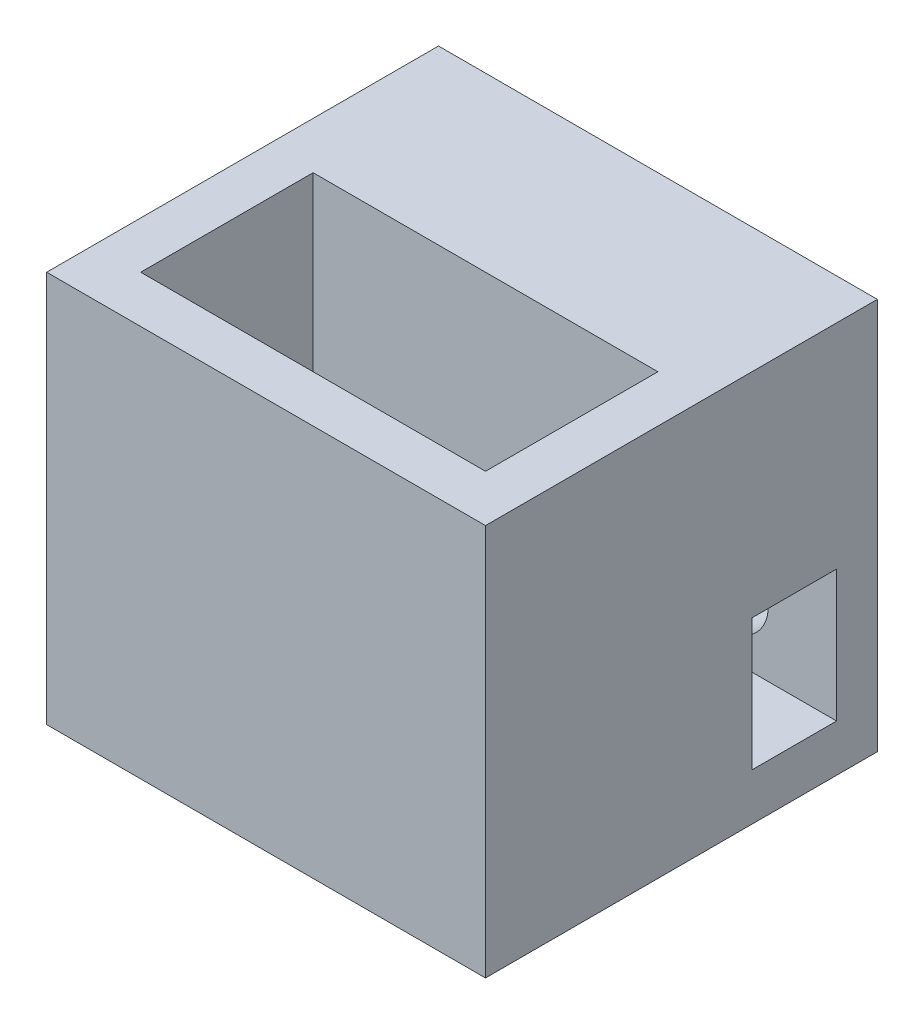
ISO-10303-21;
HEADER;
FILE_DESCRIPTION(('STEP AP214'),'2;1');
FILE_NAME('part.step','',(''),(''),'','','');
FILE_SCHEMA(('AUTOMOTIVE_DESIGN { 1 0 10303 214 1 1 1 1 }'));
ENDSEC;
DATA;
#1=APPLICATION_CONTEXT('core data for automotive mechanical design processes');
#2=APPLICATION_PROTOCOL_DEFINITION('international standard','automotive_design',2000,#1);
#3=PRODUCT_CONTEXT('',#1,'mechanical');
#4=PRODUCT('Part','Part','',(#3));
#5=PRODUCT_RELATED_PRODUCT_CATEGORY('part','',(#4));
#6=PRODUCT_DEFINITION_FORMATION('','',#4);
#7=PRODUCT_DEFINITION_CONTEXT('part definition',#1,'design');
#8=PRODUCT_DEFINITION('design','',#6,#7);
#9=PRODUCT_DEFINITION_SHAPE('','',#8);
#10=(LENGTH_UNIT() NAMED_UNIT(*) SI_UNIT(.MILLI.,.METRE.));
#11=(NAMED_UNIT(*) PLANE_ANGLE_UNIT() SI_UNIT($,.RADIAN.));
#12=(NAMED_UNIT(*) SI_UNIT($,.STERADIAN.) SOLID_ANGLE_UNIT());
#13=UNCERTAINTY_MEASURE_WITH_UNIT(LENGTH_MEASURE(1.E-05),#10,'distance_accuracy_value','');
#14=(GEOMETRIC_REPRESENTATION_CONTEXT(3) GLOBAL_UNCERTAINTY_ASSIGNED_CONTEXT((#13)) GLOBAL_UNIT_ASSIGNED_CONTEXT((#10,
#11,#12)) REPRESENTATION_CONTEXT('',''));
#15=CARTESIAN_POINT('',(0.,0.,0.));
#16=DIRECTION('',(0.,0.,1.));
#17=DIRECTION('',(1.,0.,0.));
#18=AXIS2_PLACEMENT_3D('',#15,#16,#17);
#19=CARTESIAN_POINT('',(-14.,23.,-8.5));
#20=DIRECTION('',(0.,0.,1.));
#21=DIRECTION('',(1.,0.,0.));
#22=AXIS2_PLACEMENT_3D('',#19,#20,#21);
#23=PLANE('',#22);
#24=DIRECTION('',(0.5,0.866025403784439,0.));
#25=VECTOR('',#24,1.);
#26=CARTESIAN_POINT('',(2.15025773880715,5.2,-8.5));
#27=LINE('',#26,#25);
#28=CARTESIAN_POINT('',(2.15025773880715,5.2,-8.5));
#29=VERTEX_POINT('',#28);
#30=CARTESIAN_POINT('',(4.57512886940358,9.4,-8.5));
#31=VERTEX_POINT('',#30);
#32=EDGE_CURVE('E352',#29,#31,#27,.T.);
#33=ORIENTED_EDGE('',*,*,#32,.T.);
#34=DIRECTION('',(1.,0.,0.));
#35=VECTOR('',#34,1.);
#36=CARTESIAN_POINT('',(-14.,9.4,-8.5));
#37=LINE('',#36,#35);
#38=CARTESIAN_POINT('',(14.,9.4,-8.5));
#39=VERTEX_POINT('',#38);
#40=EDGE_CURVE('E344',#31,#39,#37,.T.);
#41=ORIENTED_EDGE('',*,*,#40,.T.);
#42=DIRECTION('',(0.,-1.,0.));
#43=VECTOR('',#42,1.);
#44=CARTESIAN_POINT('',(14.,23.,-8.5));
#45=LINE('',#44,#43);
#46=CARTESIAN_POINT('',(14.,1.,-8.5));
#47=VERTEX_POINT('',#46);
#48=EDGE_CURVE('E293',#39,#47,#45,.T.);
#49=ORIENTED_EDGE('',*,*,#48,.T.);
#50=DIRECTION('',(1.,0.,0.));
#51=VECTOR('',#50,1.);
#52=CARTESIAN_POINT('',(-14.,1.,-8.5));
#53=LINE('',#52,#51);
#54=CARTESIAN_POINT('',(4.57512886940358,1.,-8.5));
#55=VERTEX_POINT('',#54);
#56=EDGE_CURVE('E195',#55,#47,#53,.T.);
#57=ORIENTED_EDGE('',*,*,#56,.F.);
#58=DIRECTION('',(-0.499999999999999,0.866025403784439,0.));
#59=VECTOR('',#58,1.);
#60=CARTESIAN_POINT('',(4.57512886940357,1.,-8.5));
#61=LINE('',#60,#59);
#62=EDGE_CURVE('E61',#55,#29,#61,.T.);
#63=ORIENTED_EDGE('',*,*,#62,.T.);
#64=EDGE_LOOP('',(#33,#41,#49,#57,#63));
#65=FACE_BOUND('',#64,.T.);
#66=ADVANCED_FACE('F45',(#65),#23,.F.);
#67=DIRECTION('',(-0.499999999999999,-0.866025403784439,0.));
#68=VECTOR('',#67,1.);
#69=CARTESIAN_POINT('',(-4.57512886940357,1.,-8.5));
#70=LINE('',#69,#68);
#71=CARTESIAN_POINT('',(-2.15025773880715,5.2,-8.5));
#72=VERTEX_POINT('',#71);
#73=CARTESIAN_POINT('',(-4.57512886940357,1.,-8.5));
#74=VERTEX_POINT('',#73);
#75=EDGE_CURVE('E171',#72,#74,#70,.T.);
#76=ORIENTED_EDGE('',*,*,#75,.T.);
#77=CARTESIAN_POINT('',(-14.,1.,-8.5));
#78=VERTEX_POINT('',#77);
#79=EDGE_CURVE('E183',#78,#74,#53,.T.);
#80=ORIENTED_EDGE('',*,*,#79,.F.);
#81=DIRECTION('',(0.,-1.,0.));
#82=VECTOR('',#81,1.);
#83=CARTESIAN_POINT('',(-14.,23.,-8.5));
#84=LINE('',#83,#82);
#85=CARTESIAN_POINT('',(-14.,9.4,-8.5));
#86=VERTEX_POINT('',#85);
#87=EDGE_CURVE('E290',#86,#78,#84,.T.);
#88=ORIENTED_EDGE('',*,*,#87,.F.);
#89=CARTESIAN_POINT('',(-4.57512886940358,9.4,-8.5));
#90=VERTEX_POINT('',#89);
#91=EDGE_CURVE('E342',#86,#90,#37,.T.);
#92=ORIENTED_EDGE('',*,*,#91,.T.);
#93=DIRECTION('',(0.5,-0.866025403784439,0.));
#94=VECTOR('',#93,1.);
#95=CARTESIAN_POINT('',(-2.15025773880715,5.2,-8.5));
#96=LINE('',#95,#94);
#97=EDGE_CURVE('E186',#90,#72,#96,.T.);
#98=ORIENTED_EDGE('',*,*,#97,.T.);
#99=EDGE_LOOP('',(#76,#80,#88,#92,#98));
#100=FACE_BOUND('',#99,.T.);
#101=ADVANCED_FACE('F182',(#100),#23,.F.);
#102=CARTESIAN_POINT('',(-14.,0.,-13.9));
#103=DIRECTION('',(0.,0.,1.));
#104=DIRECTION('',(0.,-1.,0.));
#105=AXIS2_PLACEMENT_3D('',#102,#103,#104);
#106=PLANE('',#105);
#107=CARTESIAN_POINT('',(7.,5.2,-13.9));
#108=DIRECTION('',(0.,0.,1.));
#109=DIRECTION('',(1.,0.,0.));
#110=AXIS2_PLACEMENT_3D('',#107,#108,#109);
#111=CIRCLE('',#110,2.64999999999999);
#112=CARTESIAN_POINT('',(9.64999999999999,5.2,-13.9));
#113=VERTEX_POINT('',#112);
#114=EDGE_CURVE('E414',#113,#113,#111,.T.);
#115=ORIENTED_EDGE('',*,*,#114,.F.);
#116=EDGE_LOOP('',(#115));
#117=FACE_BOUND('',#116,.T.);
#118=DIRECTION('',(1.,0.,0.));
#119=VECTOR('',#118,1.);
#120=CARTESIAN_POINT('',(-14.,9.4,-13.9));
#121=LINE('',#120,#119);
#122=CARTESIAN_POINT('',(4.57512886940358,9.4,-13.9));
#123=VERTEX_POINT('',#122);
#124=CARTESIAN_POINT('',(14.,9.4,-13.9));
#125=VERTEX_POINT('',#124);
#126=EDGE_CURVE('E341',#123,#125,#121,.T.);
#127=ORIENTED_EDGE('',*,*,#126,.F.);
#128=DIRECTION('',(0.5,0.866025403784438,0.));
#129=VECTOR('',#128,1.);
#130=CARTESIAN_POINT('',(2.15025773880715,5.2,-13.9));
#131=LINE('',#130,#129);
#132=CARTESIAN_POINT('',(2.15025773880715,5.2,-13.9));
#133=VERTEX_POINT('',#132);
#134=EDGE_CURVE('E373',#133,#123,#131,.T.);
#135=ORIENTED_EDGE('',*,*,#134,.F.);
#136=DIRECTION('',(-0.499999999999999,0.866025403784439,0.));
#137=VECTOR('',#136,1.);
#138=CARTESIAN_POINT('',(4.57512886940357,1.,-13.9));
#139=LINE('',#138,#137);
#140=CARTESIAN_POINT('',(4.57512886940357,1.,-13.9));
#141=VERTEX_POINT('',#140);
#142=EDGE_CURVE('E370',#141,#133,#139,.T.);
#143=ORIENTED_EDGE('',*,*,#142,.F.);
#144=DIRECTION('',(1.,0.,0.));
#145=VECTOR('',#144,1.);
#146=CARTESIAN_POINT('',(-14.,1.,-13.9));
#147=LINE('',#146,#145);
#148=CARTESIAN_POINT('',(14.,1.,-13.9));
#149=VERTEX_POINT('',#148);
#150=EDGE_CURVE('E207',#141,#149,#147,.T.);
#151=ORIENTED_EDGE('',*,*,#150,.T.);
#152=DIRECTION('',(0.,-1.,0.));
#153=VECTOR('',#152,1.);
#154=CARTESIAN_POINT('',(14.,0.,-13.9));
#155=LINE('',#154,#153);
#156=EDGE_CURVE('E334',#125,#149,#155,.T.);
#157=ORIENTED_EDGE('',*,*,#156,.F.);
#158=EDGE_LOOP('',(#127,#135,#143,#151,#157));
#159=FACE_BOUND('',#158,.T.);
#160=ADVANCED_FACE('F366',(#117,#159),#106,.T.);
#161=CARTESIAN_POINT('',(-7.,5.2,-13.9));
#162=DIRECTION('',(0.,0.,1.));
#163=DIRECTION('',(1.,0.,0.));
#164=AXIS2_PLACEMENT_3D('',#161,#162,#163);
#165=CIRCLE('',#164,2.64999999999999);
#166=CARTESIAN_POINT('',(-4.35000000000001,5.2,-13.9));
#167=VERTEX_POINT('',#166);
#168=EDGE_CURVE('E422',#167,#167,#165,.T.);
#169=ORIENTED_EDGE('',*,*,#168,.F.);
#170=EDGE_LOOP('',(#169));
#171=FACE_BOUND('',#170,.T.);
#172=CARTESIAN_POINT('',(-14.,1.,-13.9));
#173=VERTEX_POINT('',#172);
#174=CARTESIAN_POINT('',(-4.57512886940358,1.,-13.9));
#175=VERTEX_POINT('',#174);
#176=EDGE_CURVE('E202',#173,#175,#147,.T.);
#177=ORIENTED_EDGE('',*,*,#176,.T.);
#178=DIRECTION('',(-0.499999999999999,-0.866025403784439,0.));
#179=VECTOR('',#178,1.);
#180=CARTESIAN_POINT('',(-4.57512886940357,1.,-13.9));
#181=LINE('',#180,#179);
#182=CARTESIAN_POINT('',(-2.15025773880715,5.2,-13.9));
#183=VERTEX_POINT('',#182);
#184=EDGE_CURVE('E69',#183,#175,#181,.T.);
#185=ORIENTED_EDGE('',*,*,#184,.F.);
#186=DIRECTION('',(0.5,-0.866025403784438,0.));
#187=VECTOR('',#186,1.);
#188=CARTESIAN_POINT('',(-2.15025773880715,5.2,-13.9));
#189=LINE('',#188,#187);
#190=CARTESIAN_POINT('',(-4.57512886940358,9.4,-13.9));
#191=VERTEX_POINT('',#190);
#192=EDGE_CURVE('E405',#191,#183,#189,.T.);
#193=ORIENTED_EDGE('',*,*,#192,.F.);
#194=CARTESIAN_POINT('',(-14.,9.4,-13.9));
#195=VERTEX_POINT('',#194);
#196=EDGE_CURVE('E217',#195,#191,#121,.T.);
#197=ORIENTED_EDGE('',*,*,#196,.F.);
#198=DIRECTION('',(0.,-1.,0.));
#199=VECTOR('',#198,1.);
#200=CARTESIAN_POINT('',(-14.,0.,-13.9));
#201=LINE('',#200,#199);
#202=EDGE_CURVE('E331',#195,#173,#201,.T.);
#203=ORIENTED_EDGE('',*,*,#202,.T.);
#204=EDGE_LOOP('',(#177,#185,#193,#197,#203));
#205=FACE_BOUND('',#204,.T.);
#206=ADVANCED_FACE('F429',(#171,#205),#106,.T.);
#207=CARTESIAN_POINT('',(-14.,9.40000000000001,0.));
#208=DIRECTION('',(0.,-1.,0.));
#209=DIRECTION('',(0.,0.,-1.));
#210=AXIS2_PLACEMENT_3D('',#207,#208,#209);
#211=PLANE('',#210);
#212=ORIENTED_EDGE('',*,*,#40,.F.);
#213=DIRECTION('',(0.,0.,-1.));
#214=VECTOR('',#213,1.);
#215=CARTESIAN_POINT('',(4.57512886940358,9.4,8.502));
#216=LINE('',#215,#214);
#217=EDGE_CURVE('E362',#31,#123,#216,.T.);
#218=ORIENTED_EDGE('',*,*,#217,.T.);
#219=ORIENTED_EDGE('',*,*,#126,.T.);
#220=DIRECTION('',(0.,0.,-1.));
#221=VECTOR('',#220,1.);
#222=CARTESIAN_POINT('',(14.,9.40000000000001,0.));
#223=LINE('',#222,#221);
#224=EDGE_CURVE('E325',#39,#125,#223,.T.);
#225=ORIENTED_EDGE('',*,*,#224,.F.);
#226=EDGE_LOOP('',(#212,#218,#219,#225));
#227=FACE_BOUND('',#226,.T.);
#228=ADVANCED_FACE('F359',(#227),#211,.T.);
#229=ORIENTED_EDGE('',*,*,#196,.T.);
#230=DIRECTION('',(0.,0.,-1.));
#231=VECTOR('',#230,1.);
#232=CARTESIAN_POINT('',(-4.57512886940358,9.4,8.502));
#233=LINE('',#232,#231);
#234=EDGE_CURVE('E398',#90,#191,#233,.T.);
#235=ORIENTED_EDGE('',*,*,#234,.F.);
#236=ORIENTED_EDGE('',*,*,#91,.F.);
#237=DIRECTION('',(0.,0.,-1.));
#238=VECTOR('',#237,1.);
#239=CARTESIAN_POINT('',(-14.,9.40000000000001,0.));
#240=LINE('',#239,#238);
#241=EDGE_CURVE('E320',#86,#195,#240,.T.);
#242=ORIENTED_EDGE('',*,*,#241,.T.);
#243=EDGE_LOOP('',(#229,#235,#236,#242));
#244=FACE_BOUND('',#243,.T.);
#245=ADVANCED_FACE('F440',(#244),#211,.T.);
#246=CARTESIAN_POINT('',(-14.,0.999999999999998,0.));
#247=DIRECTION('',(0.,1.,0.));
#248=DIRECTION('',(0.,0.,1.));
#249=AXIS2_PLACEMENT_3D('',#246,#247,#248);
#250=PLANE('',#249);
#251=ORIENTED_EDGE('',*,*,#150,.F.);
#252=DIRECTION('',(0.,0.,-1.));
#253=VECTOR('',#252,1.);
#254=CARTESIAN_POINT('',(4.57512886940357,1.,8.502));
#255=LINE('',#254,#253);
#256=EDGE_CURVE('E390',#55,#141,#255,.T.);
#257=ORIENTED_EDGE('',*,*,#256,.F.);
#258=ORIENTED_EDGE('',*,*,#56,.T.);
#259=DIRECTION('',(0.,0.,1.));
#260=VECTOR('',#259,1.);
#261=CARTESIAN_POINT('',(14.,0.999999999999998,0.));
#262=LINE('',#261,#260);
#263=EDGE_CURVE('E326',#149,#47,#262,.T.);
#264=ORIENTED_EDGE('',*,*,#263,.F.);
#265=EDGE_LOOP('',(#251,#257,#258,#264));
#266=FACE_BOUND('',#265,.T.);
#267=ADVANCED_FACE('F480',(#266),#250,.T.);
#268=ORIENTED_EDGE('',*,*,#79,.T.);
#269=DIRECTION('',(0.,0.,-1.));
#270=VECTOR('',#269,1.);
#271=CARTESIAN_POINT('',(-4.57512886940357,1.,8.502));
#272=LINE('',#271,#270);
#273=EDGE_CURVE('E168',#74,#175,#272,.T.);
#274=ORIENTED_EDGE('',*,*,#273,.T.);
#275=ORIENTED_EDGE('',*,*,#176,.F.);
#276=DIRECTION('',(0.,0.,1.));
#277=VECTOR('',#276,1.);
#278=CARTESIAN_POINT('',(-14.,0.999999999999998,0.));
#279=LINE('',#278,#277);
#280=EDGE_CURVE('E192',#173,#78,#279,.T.);
#281=ORIENTED_EDGE('',*,*,#280,.T.);
#282=EDGE_LOOP('',(#268,#274,#275,#281));
#283=FACE_BOUND('',#282,.T.);
#284=ADVANCED_FACE('F190',(#283),#250,.T.);
#285=CARTESIAN_POINT('',(0.,23.,0.));
#286=DIRECTION('',(0.,-1.,0.));
#287=DIRECTION('',(0.,0.,-1.));
#288=AXIS2_PLACEMENT_3D('',#285,#286,#287);
#289=PLANE('',#288);
#290=DIRECTION('',(0.,0.,1.));
#291=VECTOR('',#290,1.);
#292=CARTESIAN_POINT('',(-14.,23.,8.5));
#293=LINE('',#292,#291);
#294=CARTESIAN_POINT('',(-14.,23.,-16.5));
#295=VERTEX_POINT('',#294);
#296=CARTESIAN_POINT('',(-14.,23.,8.5));
#297=VERTEX_POINT('',#296);
#298=EDGE_CURVE('E280',#295,#297,#293,.T.);
#299=ORIENTED_EDGE('',*,*,#298,.T.);
#300=DIRECTION('',(1.,0.,0.));
#301=VECTOR('',#300,1.);
#302=CARTESIAN_POINT('',(-14.,23.,8.5));
#303=LINE('',#302,#301);
#304=CARTESIAN_POINT('',(14.,23.,8.5));
#305=VERTEX_POINT('',#304);
#306=EDGE_CURVE('E284',#297,#305,#303,.T.);
#307=ORIENTED_EDGE('',*,*,#306,.T.);
#308=DIRECTION('',(0.,0.,-1.));
#309=VECTOR('',#308,1.);
#310=CARTESIAN_POINT('',(14.,23.,8.5));
#311=LINE('',#310,#309);
#312=CARTESIAN_POINT('',(14.,23.,-16.5));
#313=VERTEX_POINT('',#312);
#314=EDGE_CURVE('E287',#305,#313,#311,.T.);
#315=ORIENTED_EDGE('',*,*,#314,.T.);
#316=DIRECTION('',(1.,0.,0.));
#317=VECTOR('',#316,1.);
#318=CARTESIAN_POINT('',(-14.,23.,-16.5));
#319=LINE('',#318,#317);
#320=EDGE_CURVE('E200',#295,#313,#319,.T.);
#321=ORIENTED_EDGE('',*,*,#320,.F.);
#322=EDGE_LOOP('',(#299,#307,#315,#321));
#323=FACE_BOUND('',#322,.T.);
#324=DIRECTION('',(0.,0.,-1.));
#325=VECTOR('',#324,1.);
#326=CARTESIAN_POINT('',(11.,23.,5.5));
#327=LINE('',#326,#325);
#328=CARTESIAN_POINT('',(11.,23.,5.5));
#329=VERTEX_POINT('',#328);
#330=CARTESIAN_POINT('',(11.,23.,-5.5));
#331=VERTEX_POINT('',#330);
#332=EDGE_CURVE('E237',#329,#331,#327,.T.);
#333=ORIENTED_EDGE('',*,*,#332,.F.);
#334=DIRECTION('',(1.,0.,0.));
#335=VECTOR('',#334,1.);
#336=CARTESIAN_POINT('',(-11.,23.,5.5));
#337=LINE('',#336,#335);
#338=CARTESIAN_POINT('',(-11.,23.,5.5));
#339=VERTEX_POINT('',#338);
#340=EDGE_CURVE('E248',#339,#329,#337,.T.);
#341=ORIENTED_EDGE('',*,*,#340,.F.);
#342=DIRECTION('',(0.,0.,1.));
#343=VECTOR('',#342,1.);
#344=CARTESIAN_POINT('',(-11.,23.,5.5));
#345=LINE('',#344,#343);
#346=CARTESIAN_POINT('',(-11.,23.,-5.5));
#347=VERTEX_POINT('',#346);
#348=EDGE_CURVE('E244',#347,#339,#345,.T.);
#349=ORIENTED_EDGE('',*,*,#348,.F.);
#350=DIRECTION('',(-1.,0.,0.));
#351=VECTOR('',#350,1.);
#352=CARTESIAN_POINT('',(-11.,23.,-5.5));
#353=LINE('',#352,#351);
#354=EDGE_CURVE('E240',#331,#347,#353,.T.);
#355=ORIENTED_EDGE('',*,*,#354,.F.);
#356=EDGE_LOOP('',(#333,#341,#349,#355));
#357=FACE_BOUND('',#356,.T.);
#358=ADVANCED_FACE('F465',(#323,#357),#289,.F.);
#359=CARTESIAN_POINT('',(-14.,23.,8.5));
#360=DIRECTION('',(1.,0.,0.));
#361=DIRECTION('',(0.,0.,-1.));
#362=AXIS2_PLACEMENT_3D('',#359,#360,#361);
#363=PLANE('',#362);
#364=ORIENTED_EDGE('',*,*,#87,.T.);
#365=ORIENTED_EDGE('',*,*,#280,.F.);
#366=ORIENTED_EDGE('',*,*,#202,.F.);
#367=ORIENTED_EDGE('',*,*,#241,.F.);
#368=EDGE_LOOP('',(#364,#365,#366,#367));
#369=FACE_BOUND('',#368,.T.);
#370=ORIENTED_EDGE('',*,*,#298,.F.);
#371=DIRECTION('',(0.,-1.,0.));
#372=VECTOR('',#371,1.);
#373=CARTESIAN_POINT('',(-14.,0.,-16.5));
#374=LINE('',#373,#372);
#375=CARTESIAN_POINT('',(-14.,-2.,-16.5));
#376=VERTEX_POINT('',#375);
#377=EDGE_CURVE('E315',#295,#376,#374,.T.);
#378=ORIENTED_EDGE('',*,*,#377,.T.);
#379=DIRECTION('',(0.,0.,-1.));
#380=VECTOR('',#379,1.);
#381=CARTESIAN_POINT('',(-14.,-2.,8.5));
#382=LINE('',#381,#380);
#383=CARTESIAN_POINT('',(-14.,-2.,8.5));
#384=VERTEX_POINT('',#383);
#385=EDGE_CURVE('E229',#384,#376,#382,.T.);
#386=ORIENTED_EDGE('',*,*,#385,.F.);
#387=DIRECTION('',(0.,-1.,0.));
#388=VECTOR('',#387,1.);
#389=CARTESIAN_POINT('',(-14.,23.,8.5));
#390=LINE('',#389,#388);
#391=EDGE_CURVE('E11',#297,#384,#390,.T.);
#392=ORIENTED_EDGE('',*,*,#391,.F.);
#393=EDGE_LOOP('',(#370,#378,#386,#392));
#394=FACE_BOUND('',#393,.T.);
#395=ADVANCED_FACE('F47',(#369,#394),#363,.F.);
#396=CARTESIAN_POINT('',(0.,23.,8.5));
#397=DIRECTION('',(0.,0.,-1.));
#398=DIRECTION('',(-1.,0.,0.));
#399=AXIS2_PLACEMENT_3D('',#396,#397,#398);
#400=PLANE('',#399);
#401=ORIENTED_EDGE('',*,*,#391,.T.);
#402=DIRECTION('',(-1.,0.,0.));
#403=VECTOR('',#402,1.);
#404=CARTESIAN_POINT('',(14.,-2.,8.5));
#405=LINE('',#404,#403);
#406=CARTESIAN_POINT('',(14.,-2.,8.5));
#407=VERTEX_POINT('',#406);
#408=EDGE_CURVE('E222',#407,#384,#405,.T.);
#409=ORIENTED_EDGE('',*,*,#408,.F.);
#410=DIRECTION('',(0.,-1.,0.));
#411=VECTOR('',#410,1.);
#412=CARTESIAN_POINT('',(14.,23.,8.5));
#413=LINE('',#412,#411);
#414=EDGE_CURVE('E54',#305,#407,#413,.T.);
#415=ORIENTED_EDGE('',*,*,#414,.F.);
#416=ORIENTED_EDGE('',*,*,#306,.F.);
#417=EDGE_LOOP('',(#401,#409,#415,#416));
#418=FACE_BOUND('',#417,.T.);
#419=ADVANCED_FACE('F309',(#418),#400,.F.);
#420=CARTESIAN_POINT('',(14.,23.,8.5));
#421=DIRECTION('',(-1.,0.,0.));
#422=DIRECTION('',(0.,0.,1.));
#423=AXIS2_PLACEMENT_3D('',#420,#421,#422);
#424=PLANE('',#423);
#425=ORIENTED_EDGE('',*,*,#263,.T.);
#426=ORIENTED_EDGE('',*,*,#48,.F.);
#427=ORIENTED_EDGE('',*,*,#224,.T.);
#428=ORIENTED_EDGE('',*,*,#156,.T.);
#429=EDGE_LOOP('',(#425,#426,#427,#428));
#430=FACE_BOUND('',#429,.T.);
#431=ORIENTED_EDGE('',*,*,#414,.T.);
#432=DIRECTION('',(0.,0.,1.));
#433=VECTOR('',#432,1.);
#434=CARTESIAN_POINT('',(14.,-2.,-8.5));
#435=LINE('',#434,#433);
#436=CARTESIAN_POINT('',(14.,-2.,-16.5));
#437=VERTEX_POINT('',#436);
#438=EDGE_CURVE('E232',#437,#407,#435,.T.);
#439=ORIENTED_EDGE('',*,*,#438,.F.);
#440=DIRECTION('',(0.,-1.,0.));
#441=VECTOR('',#440,1.);
#442=CARTESIAN_POINT('',(14.,0.,-16.5));
#443=LINE('',#442,#441);
#444=EDGE_CURVE('E323',#313,#437,#443,.T.);
#445=ORIENTED_EDGE('',*,*,#444,.F.);
#446=ORIENTED_EDGE('',*,*,#314,.F.);
#447=EDGE_LOOP('',(#431,#439,#445,#446));
#448=FACE_BOUND('',#447,.T.);
#449=ADVANCED_FACE('F300',(#430,#448),#424,.F.);
#450=CARTESIAN_POINT('',(11.,23.,5.5));
#451=DIRECTION('',(-1.,0.,0.));
#452=DIRECTION('',(0.,0.,1.));
#453=AXIS2_PLACEMENT_3D('',#450,#451,#452);
#454=PLANE('',#453);
#455=DIRECTION('',(0.,0.,-1.));
#456=VECTOR('',#455,1.);
#457=CARTESIAN_POINT('',(11.,0.,5.5));
#458=LINE('',#457,#456);
#459=CARTESIAN_POINT('',(11.,0.,5.5));
#460=VERTEX_POINT('',#459);
#461=CARTESIAN_POINT('',(11.,0.,-5.5));
#462=VERTEX_POINT('',#461);
#463=EDGE_CURVE('E236',#460,#462,#458,.T.);
#464=ORIENTED_EDGE('',*,*,#463,.F.);
#465=DIRECTION('',(0.,-1.,0.));
#466=VECTOR('',#465,1.);
#467=CARTESIAN_POINT('',(11.,23.,5.5));
#468=LINE('',#467,#466);
#469=EDGE_CURVE('E251',#329,#460,#468,.T.);
#470=ORIENTED_EDGE('',*,*,#469,.F.);
#471=ORIENTED_EDGE('',*,*,#332,.T.);
#472=DIRECTION('',(0.,-1.,0.));
#473=VECTOR('',#472,1.);
#474=CARTESIAN_POINT('',(11.,23.,-5.5));
#475=LINE('',#474,#473);
#476=EDGE_CURVE('E276',#331,#462,#475,.T.);
#477=ORIENTED_EDGE('',*,*,#476,.T.);
#478=EDGE_LOOP('',(#464,#470,#471,#477));
#479=FACE_BOUND('',#478,.T.);
#480=ADVANCED_FACE('F468',(#479),#454,.T.);
#481=CARTESIAN_POINT('',(-11.,23.,-5.5));
#482=DIRECTION('',(0.,0.,1.));
#483=DIRECTION('',(1.,0.,0.));
#484=AXIS2_PLACEMENT_3D('',#481,#482,#483);
#485=PLANE('',#484);
#486=DIRECTION('',(-1.,0.,0.));
#487=VECTOR('',#486,1.);
#488=CARTESIAN_POINT('',(-11.,0.,-5.5));
#489=LINE('',#488,#487);
#490=CARTESIAN_POINT('',(-11.,0.,-5.5));
#491=VERTEX_POINT('',#490);
#492=EDGE_CURVE('E255',#462,#491,#489,.T.);
#493=ORIENTED_EDGE('',*,*,#492,.F.);
#494=ORIENTED_EDGE('',*,*,#476,.F.);
#495=ORIENTED_EDGE('',*,*,#354,.T.);
#496=DIRECTION('',(0.,-1.,0.));
#497=VECTOR('',#496,1.);
#498=CARTESIAN_POINT('',(-11.,23.,-5.5));
#499=LINE('',#498,#497);
#500=EDGE_CURVE('E273',#347,#491,#499,.T.);
#501=ORIENTED_EDGE('',*,*,#500,.T.);
#502=EDGE_LOOP('',(#493,#494,#495,#501));
#503=FACE_BOUND('',#502,.T.);
#504=ADVANCED_FACE('F491',(#503),#485,.T.);
#505=CARTESIAN_POINT('',(-11.,23.,5.5));
#506=DIRECTION('',(1.,0.,0.));
#507=DIRECTION('',(0.,0.,-1.));
#508=AXIS2_PLACEMENT_3D('',#505,#506,#507);
#509=PLANE('',#508);
#510=DIRECTION('',(0.,0.,1.));
#511=VECTOR('',#510,1.);
#512=CARTESIAN_POINT('',(-11.,0.,5.5));
#513=LINE('',#512,#511);
#514=CARTESIAN_POINT('',(-11.,0.,5.5));
#515=VERTEX_POINT('',#514);
#516=EDGE_CURVE('E259',#491,#515,#513,.T.);
#517=ORIENTED_EDGE('',*,*,#516,.F.);
#518=ORIENTED_EDGE('',*,*,#500,.F.);
#519=ORIENTED_EDGE('',*,*,#348,.T.);
#520=DIRECTION('',(0.,-1.,0.));
#521=VECTOR('',#520,1.);
#522=CARTESIAN_POINT('',(-11.,23.,5.5));
#523=LINE('',#522,#521);
#524=EDGE_CURVE('E269',#339,#515,#523,.T.);
#525=ORIENTED_EDGE('',*,*,#524,.T.);
#526=EDGE_LOOP('',(#517,#518,#519,#525));
#527=FACE_BOUND('',#526,.T.);
#528=ADVANCED_FACE('F499',(#527),#509,.T.);
#529=CARTESIAN_POINT('',(-11.,23.,5.5));
#530=DIRECTION('',(0.,0.,-1.));
#531=DIRECTION('',(-1.,0.,0.));
#532=AXIS2_PLACEMENT_3D('',#529,#530,#531);
#533=PLANE('',#532);
#534=DIRECTION('',(1.,0.,0.));
#535=VECTOR('',#534,1.);
#536=CARTESIAN_POINT('',(-11.,0.,5.5));
#537=LINE('',#536,#535);
#538=EDGE_CURVE('E241',#515,#460,#537,.T.);
#539=ORIENTED_EDGE('',*,*,#538,.F.);
#540=ORIENTED_EDGE('',*,*,#524,.F.);
#541=ORIENTED_EDGE('',*,*,#340,.T.);
#542=ORIENTED_EDGE('',*,*,#469,.T.);
#543=EDGE_LOOP('',(#539,#540,#541,#542));
#544=FACE_BOUND('',#543,.T.);
#545=ADVANCED_FACE('F497',(#544),#533,.T.);
#546=CARTESIAN_POINT('',(0.,0.,0.));
#547=DIRECTION('',(0.,-1.,0.));
#548=DIRECTION('',(0.,0.,-1.));
#549=AXIS2_PLACEMENT_3D('',#546,#547,#548);
#550=PLANE('',#549);
#551=CARTESIAN_POINT('',(5.5,0.,0.));
#552=DIRECTION('',(0.,-1.,0.));
#553=DIRECTION('',(0.,0.,-1.));
#554=AXIS2_PLACEMENT_3D('',#551,#552,#553);
#555=CIRCLE('',#554,3.);
#556=CARTESIAN_POINT('',(5.5,0.,-3.));
#557=VERTEX_POINT('',#556);
#558=EDGE_CURVE('E213',#557,#557,#555,.T.);
#559=ORIENTED_EDGE('',*,*,#558,.T.);
#560=EDGE_LOOP('',(#559));
#561=FACE_BOUND('',#560,.T.);
#562=CARTESIAN_POINT('',(-5.5,0.,0.));
#563=DIRECTION('',(0.,-1.,0.));
#564=DIRECTION('',(0.,0.,-1.));
#565=AXIS2_PLACEMENT_3D('',#562,#563,#564);
#566=CIRCLE('',#565,3.);
#567=CARTESIAN_POINT('',(-5.5,0.,-3.));
#568=VERTEX_POINT('',#567);
#569=EDGE_CURVE('E212',#568,#568,#566,.T.);
#570=ORIENTED_EDGE('',*,*,#569,.T.);
#571=EDGE_LOOP('',(#570));
#572=FACE_BOUND('',#571,.T.);
#573=ORIENTED_EDGE('',*,*,#516,.T.);
#574=ORIENTED_EDGE('',*,*,#538,.T.);
#575=ORIENTED_EDGE('',*,*,#463,.T.);
#576=ORIENTED_EDGE('',*,*,#492,.T.);
#577=EDGE_LOOP('',(#573,#574,#575,#576));
#578=FACE_BOUND('',#577,.T.);
#579=ADVANCED_FACE('F495',(#561,#572,#578),#550,.F.);
#580=CARTESIAN_POINT('',(0.,-2.,0.));
#581=DIRECTION('',(0.,-1.,0.));
#582=DIRECTION('',(0.,0.,-1.));
#583=AXIS2_PLACEMENT_3D('',#580,#581,#582);
#584=PLANE('',#583);
#585=CARTESIAN_POINT('',(-5.5,-2.,0.));
#586=DIRECTION('',(0.,-1.,0.));
#587=DIRECTION('',(0.,0.,-1.));
#588=AXIS2_PLACEMENT_3D('',#585,#586,#587);
#589=CIRCLE('',#588,3.);
#590=CARTESIAN_POINT('',(-5.5,-2.,-3.));
#591=VERTEX_POINT('',#590);
#592=EDGE_CURVE('E218',#591,#591,#589,.T.);
#593=ORIENTED_EDGE('',*,*,#592,.F.);
#594=EDGE_LOOP('',(#593));
#595=FACE_BOUND('',#594,.T.);
#596=ORIENTED_EDGE('',*,*,#408,.T.);
#597=ORIENTED_EDGE('',*,*,#385,.T.);
#598=DIRECTION('',(1.,0.,0.));
#599=VECTOR('',#598,1.);
#600=CARTESIAN_POINT('',(-14.,-2.,-16.5));
#601=LINE('',#600,#599);
#602=EDGE_CURVE('E194',#376,#437,#601,.T.);
#603=ORIENTED_EDGE('',*,*,#602,.T.);
#604=ORIENTED_EDGE('',*,*,#438,.T.);
#605=EDGE_LOOP('',(#596,#597,#603,#604));
#606=FACE_BOUND('',#605,.T.);
#607=CARTESIAN_POINT('',(5.5,-2.,0.));
#608=DIRECTION('',(0.,-1.,0.));
#609=DIRECTION('',(0.,0.,-1.));
#610=AXIS2_PLACEMENT_3D('',#607,#608,#609);
#611=CIRCLE('',#610,3.);
#612=CARTESIAN_POINT('',(5.5,-2.,-3.));
#613=VERTEX_POINT('',#612);
#614=EDGE_CURVE('E208',#613,#613,#611,.T.);
#615=ORIENTED_EDGE('',*,*,#614,.F.);
#616=EDGE_LOOP('',(#615));
#617=FACE_BOUND('',#616,.T.);
#618=ADVANCED_FACE('F305',(#595,#606,#617),#584,.T.);
#619=CARTESIAN_POINT('',(-5.5,-2.,0.));
#620=DIRECTION('',(0.,1.,0.));
#621=DIRECTION('',(0.,0.,1.));
#622=AXIS2_PLACEMENT_3D('',#619,#620,#621);
#623=CYLINDRICAL_SURFACE('',#622,3.);
#624=ORIENTED_EDGE('',*,*,#592,.T.);
#625=EDGE_LOOP('',(#624));
#626=FACE_BOUND('',#625,.T.);
#627=ORIENTED_EDGE('',*,*,#569,.F.);
#628=EDGE_LOOP('',(#627));
#629=FACE_BOUND('',#628,.T.);
#630=ADVANCED_FACE('F549',(#626,#629),#623,.F.);
#631=CARTESIAN_POINT('',(5.5,-2.,0.));
#632=DIRECTION('',(0.,1.,0.));
#633=DIRECTION('',(0.,0.,1.));
#634=AXIS2_PLACEMENT_3D('',#631,#632,#633);
#635=CYLINDRICAL_SURFACE('',#634,3.);
#636=ORIENTED_EDGE('',*,*,#614,.T.);
#637=EDGE_LOOP('',(#636));
#638=FACE_BOUND('',#637,.T.);
#639=ORIENTED_EDGE('',*,*,#558,.F.);
#640=EDGE_LOOP('',(#639));
#641=FACE_BOUND('',#640,.T.);
#642=ADVANCED_FACE('F554',(#638,#641),#635,.F.);
#643=CARTESIAN_POINT('',(-14.,0.,-16.5));
#644=DIRECTION('',(0.,0.,1.));
#645=DIRECTION('',(0.,-1.,0.));
#646=AXIS2_PLACEMENT_3D('',#643,#644,#645);
#647=PLANE('',#646);
#648=CARTESIAN_POINT('',(-7.,5.2,-16.5));
#649=DIRECTION('',(0.,0.,1.));
#650=DIRECTION('',(1.,0.,0.));
#651=AXIS2_PLACEMENT_3D('',#648,#649,#650);
#652=CIRCLE('',#651,2.65);
#653=CARTESIAN_POINT('',(-4.35,5.2,-16.5));
#654=VERTEX_POINT('',#653);
#655=EDGE_CURVE('E418',#654,#654,#652,.T.);
#656=ORIENTED_EDGE('',*,*,#655,.T.);
#657=EDGE_LOOP('',(#656));
#658=FACE_BOUND('',#657,.T.);
#659=CARTESIAN_POINT('',(7.,5.2,-16.5));
#660=DIRECTION('',(0.,0.,1.));
#661=DIRECTION('',(1.,0.,0.));
#662=AXIS2_PLACEMENT_3D('',#659,#660,#661);
#663=CIRCLE('',#662,2.65);
#664=CARTESIAN_POINT('',(9.65,5.2,-16.5));
#665=VERTEX_POINT('',#664);
#666=EDGE_CURVE('E188',#665,#665,#663,.T.);
#667=ORIENTED_EDGE('',*,*,#666,.T.);
#668=EDGE_LOOP('',(#667));
#669=FACE_BOUND('',#668,.T.);
#670=ORIENTED_EDGE('',*,*,#444,.T.);
#671=ORIENTED_EDGE('',*,*,#602,.F.);
#672=ORIENTED_EDGE('',*,*,#377,.F.);
#673=ORIENTED_EDGE('',*,*,#320,.T.);
#674=EDGE_LOOP('',(#670,#671,#672,#673));
#675=FACE_BOUND('',#674,.T.);
#676=ADVANCED_FACE('F322',(#658,#669,#675),#647,.F.);
#677=CARTESIAN_POINT('',(-4.57512886940357,1.,8.502));
#678=DIRECTION('',(0.866025403784439,-0.499999999999999,0.));
#679=DIRECTION('',(0.499999999999999,0.866025403784439,0.));
#680=AXIS2_PLACEMENT_3D('',#677,#678,#679);
#681=PLANE('',#680);
#682=ORIENTED_EDGE('',*,*,#75,.F.);
#683=DIRECTION('',(0.,0.,-1.));
#684=VECTOR('',#683,1.);
#685=CARTESIAN_POINT('',(-2.15025773880715,5.2,8.502));
#686=LINE('',#685,#684);
#687=EDGE_CURVE('E177',#72,#183,#686,.T.);
#688=ORIENTED_EDGE('',*,*,#687,.T.);
#689=ORIENTED_EDGE('',*,*,#184,.T.);
#690=ORIENTED_EDGE('',*,*,#273,.F.);
#691=EDGE_LOOP('',(#682,#688,#689,#690));
#692=FACE_BOUND('',#691,.T.);
#693=ADVANCED_FACE('F170',(#692),#681,.F.);
#694=CARTESIAN_POINT('',(-2.15025773880715,5.2,8.502));
#695=DIRECTION('',(0.866025403784438,0.5,0.));
#696=DIRECTION('',(-0.5,0.866025403784439,0.));
#697=AXIS2_PLACEMENT_3D('',#694,#695,#696);
#698=PLANE('',#697);
#699=ORIENTED_EDGE('',*,*,#97,.F.);
#700=ORIENTED_EDGE('',*,*,#234,.T.);
#701=ORIENTED_EDGE('',*,*,#192,.T.);
#702=ORIENTED_EDGE('',*,*,#687,.F.);
#703=EDGE_LOOP('',(#699,#700,#701,#702));
#704=FACE_BOUND('',#703,.T.);
#705=ADVANCED_FACE('F442',(#704),#698,.F.);
#706=CARTESIAN_POINT('',(2.15025773880715,5.2,8.502));
#707=DIRECTION('',(-0.866025403784438,0.5,0.));
#708=DIRECTION('',(-0.5,-0.866025403784439,0.));
#709=AXIS2_PLACEMENT_3D('',#706,#707,#708);
#710=PLANE('',#709);
#711=ORIENTED_EDGE('',*,*,#32,.F.);
#712=DIRECTION('',(0.,0.,-1.));
#713=VECTOR('',#712,1.);
#714=CARTESIAN_POINT('',(2.15025773880715,5.2,8.502));
#715=LINE('',#714,#713);
#716=EDGE_CURVE('E393',#29,#133,#715,.T.);
#717=ORIENTED_EDGE('',*,*,#716,.T.);
#718=ORIENTED_EDGE('',*,*,#134,.T.);
#719=ORIENTED_EDGE('',*,*,#217,.F.);
#720=EDGE_LOOP('',(#711,#717,#718,#719));
#721=FACE_BOUND('',#720,.T.);
#722=ADVANCED_FACE('F444',(#721),#710,.F.);
#723=CARTESIAN_POINT('',(4.57512886940357,1.,8.502));
#724=DIRECTION('',(-0.866025403784439,-0.499999999999999,0.));
#725=DIRECTION('',(0.499999999999999,-0.866025403784439,0.));
#726=AXIS2_PLACEMENT_3D('',#723,#724,#725);
#727=PLANE('',#726);
#728=ORIENTED_EDGE('',*,*,#62,.F.);
#729=ORIENTED_EDGE('',*,*,#256,.T.);
#730=ORIENTED_EDGE('',*,*,#142,.T.);
#731=ORIENTED_EDGE('',*,*,#716,.F.);
#732=EDGE_LOOP('',(#728,#729,#730,#731));
#733=FACE_BOUND('',#732,.T.);
#734=ADVANCED_FACE('F446',(#733),#727,.F.);
#735=CARTESIAN_POINT('',(7.,5.2,-13.9));
#736=DIRECTION('',(0.,0.,1.));
#737=DIRECTION('',(1.,0.,0.));
#738=AXIS2_PLACEMENT_3D('',#735,#736,#737);
#739=CYLINDRICAL_SURFACE('',#738,2.64999999999999);
#740=ORIENTED_EDGE('',*,*,#666,.F.);
#741=EDGE_LOOP('',(#740));
#742=FACE_BOUND('',#741,.T.);
#743=ORIENTED_EDGE('',*,*,#114,.T.);
#744=EDGE_LOOP('',(#743));
#745=FACE_BOUND('',#744,.T.);
#746=ADVANCED_FACE('F453',(#742,#745),#739,.F.);
#747=CARTESIAN_POINT('',(-7.,5.2,-13.9));
#748=DIRECTION('',(0.,0.,1.));
#749=DIRECTION('',(1.,0.,0.));
#750=AXIS2_PLACEMENT_3D('',#747,#748,#749);
#751=CYLINDRICAL_SURFACE('',#750,2.64999999999999);
#752=ORIENTED_EDGE('',*,*,#655,.F.);
#753=EDGE_LOOP('',(#752));
#754=FACE_BOUND('',#753,.T.);
#755=ORIENTED_EDGE('',*,*,#168,.T.);
#756=EDGE_LOOP('',(#755));
#757=FACE_BOUND('',#756,.T.);
#758=ADVANCED_FACE('F427',(#754,#757),#751,.F.);
#759=CLOSED_SHELL('',(#66,#101,#160,#206,#228,#245,#267,#284,#358,#395,#419,#449,#480,#504,#528,
#545,#579,#618,#630,#642,#676,#693,#705,#722,#734,#746,#758));
#760=MANIFOLD_SOLID_BREP('B2',#759);
#761=ADVANCED_BREP_SHAPE_REPRESENTATION('',(#18,#760),#14);
#762=SHAPE_DEFINITION_REPRESENTATION(#9,#761);
ENDSEC;
END-ISO-10303-21;
